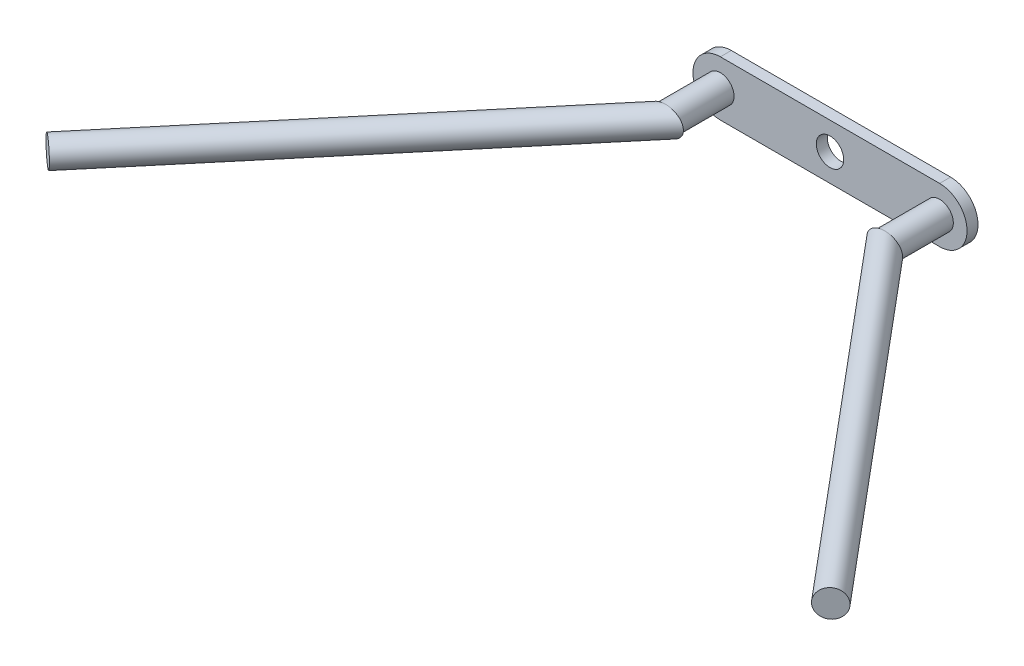
ISO-10303-21;
HEADER;
FILE_DESCRIPTION(('STEP AP214'),'2;1');
FILE_NAME('part.step','',(''),(''),'','','');
FILE_SCHEMA(('AUTOMOTIVE_DESIGN { 1 0 10303 214 1 1 1 1 }'));
ENDSEC;
DATA;
#1=APPLICATION_CONTEXT('core data for automotive mechanical design processes');
#2=APPLICATION_PROTOCOL_DEFINITION('international standard','automotive_design',2000,#1);
#3=PRODUCT_CONTEXT('',#1,'mechanical');
#4=PRODUCT('Part','Part','',(#3));
#5=PRODUCT_RELATED_PRODUCT_CATEGORY('part','',(#4));
#6=PRODUCT_DEFINITION_FORMATION('','',#4);
#7=PRODUCT_DEFINITION_CONTEXT('part definition',#1,'design');
#8=PRODUCT_DEFINITION('design','',#6,#7);
#9=PRODUCT_DEFINITION_SHAPE('','',#8);
#10=(LENGTH_UNIT() NAMED_UNIT(*) SI_UNIT(.MILLI.,.METRE.));
#11=(NAMED_UNIT(*) PLANE_ANGLE_UNIT() SI_UNIT($,.RADIAN.));
#12=(NAMED_UNIT(*) SI_UNIT($,.STERADIAN.) SOLID_ANGLE_UNIT());
#13=UNCERTAINTY_MEASURE_WITH_UNIT(LENGTH_MEASURE(1.E-05),#10,'distance_accuracy_value','');
#14=(GEOMETRIC_REPRESENTATION_CONTEXT(3) GLOBAL_UNCERTAINTY_ASSIGNED_CONTEXT((#13)) GLOBAL_UNIT_ASSIGNED_CONTEXT((#10,
#11,#12)) REPRESENTATION_CONTEXT('',''));
#15=CARTESIAN_POINT('',(0.,0.,0.));
#16=DIRECTION('',(0.,0.,1.));
#17=DIRECTION('',(1.,0.,0.));
#18=AXIS2_PLACEMENT_3D('',#15,#16,#17);
#19=CARTESIAN_POINT('',(0.,0.,2.));
#20=DIRECTION('',(0.,0.,1.));
#21=DIRECTION('',(1.,0.,0.));
#22=AXIS2_PLACEMENT_3D('',#19,#20,#21);
#23=PLANE('',#22);
#24=CARTESIAN_POINT('',(40.,0.,2.));
#25=DIRECTION('',(0.,0.,1.));
#26=DIRECTION('',(1.,0.,0.));
#27=AXIS2_PLACEMENT_3D('',#24,#25,#26);
#28=CIRCLE('',#27,2.5);
#29=CARTESIAN_POINT('',(42.5,0.,2.));
#30=VERTEX_POINT('',#29);
#31=EDGE_CURVE('E95',#30,#30,#28,.T.);
#32=ORIENTED_EDGE('',*,*,#31,.F.);
#33=EDGE_LOOP('',(#32));
#34=FACE_BOUND('',#33,.T.);
#35=CARTESIAN_POINT('',(0.,0.,2.));
#36=DIRECTION('',(0.,0.,1.));
#37=DIRECTION('',(1.,0.,0.));
#38=AXIS2_PLACEMENT_3D('',#35,#36,#37);
#39=CIRCLE('',#38,2.5);
#40=CARTESIAN_POINT('',(2.5,0.,2.));
#41=VERTEX_POINT('',#40);
#42=EDGE_CURVE('E88',#41,#41,#39,.T.);
#43=ORIENTED_EDGE('',*,*,#42,.F.);
#44=EDGE_LOOP('',(#43));
#45=FACE_BOUND('',#44,.T.);
#46=CARTESIAN_POINT('',(0.,0.,2.));
#47=DIRECTION('',(0.,0.,1.));
#48=DIRECTION('',(1.,0.,0.));
#49=AXIS2_PLACEMENT_3D('',#46,#47,#48);
#50=CIRCLE('',#49,5.);
#51=CARTESIAN_POINT('',(0.,5.,2.));
#52=VERTEX_POINT('',#51);
#53=CARTESIAN_POINT('',(0.,-5.,2.));
#54=VERTEX_POINT('',#53);
#55=EDGE_CURVE('E125',#52,#54,#50,.T.);
#56=ORIENTED_EDGE('',*,*,#55,.T.);
#57=DIRECTION('',(1.,0.,0.));
#58=VECTOR('',#57,1.);
#59=CARTESIAN_POINT('',(0.,-5.,2.));
#60=LINE('',#59,#58);
#61=CARTESIAN_POINT('',(40.,-5.,2.));
#62=VERTEX_POINT('',#61);
#63=EDGE_CURVE('E128',#54,#62,#60,.T.);
#64=ORIENTED_EDGE('',*,*,#63,.T.);
#65=CARTESIAN_POINT('',(40.,0.,2.));
#66=DIRECTION('',(0.,0.,1.));
#67=DIRECTION('',(1.,0.,0.));
#68=AXIS2_PLACEMENT_3D('',#65,#66,#67);
#69=CIRCLE('',#68,5.);
#70=CARTESIAN_POINT('',(40.,5.,2.));
#71=VERTEX_POINT('',#70);
#72=EDGE_CURVE('E131',#62,#71,#69,.T.);
#73=ORIENTED_EDGE('',*,*,#72,.T.);
#74=DIRECTION('',(-1.,0.,0.));
#75=VECTOR('',#74,1.);
#76=CARTESIAN_POINT('',(0.,5.,2.));
#77=LINE('',#76,#75);
#78=EDGE_CURVE('E133',#71,#52,#77,.T.);
#79=ORIENTED_EDGE('',*,*,#78,.T.);
#80=EDGE_LOOP('',(#56,#64,#73,#79));
#81=FACE_BOUND('',#80,.T.);
#82=CARTESIAN_POINT('',(20.,0.,2.));
#83=DIRECTION('',(0.,0.,1.));
#84=DIRECTION('',(1.,0.,0.));
#85=AXIS2_PLACEMENT_3D('',#82,#83,#84);
#86=CIRCLE('',#85,2.5);
#87=CARTESIAN_POINT('',(22.5,0.,2.));
#88=VERTEX_POINT('',#87);
#89=EDGE_CURVE('E119',#88,#88,#86,.T.);
#90=ORIENTED_EDGE('',*,*,#89,.F.);
#91=EDGE_LOOP('',(#90));
#92=FACE_BOUND('',#91,.T.);
#93=ADVANCED_FACE('F32',(#34,#45,#81,#92),#23,.T.);
#94=CARTESIAN_POINT('',(0.,0.,0.));
#95=DIRECTION('',(0.,0.,1.));
#96=DIRECTION('',(1.,0.,0.));
#97=AXIS2_PLACEMENT_3D('',#94,#95,#96);
#98=PLANE('',#97);
#99=CARTESIAN_POINT('',(0.,0.,0.));
#100=DIRECTION('',(0.,0.,1.));
#101=DIRECTION('',(1.,0.,0.));
#102=AXIS2_PLACEMENT_3D('',#99,#100,#101);
#103=CIRCLE('',#102,5.);
#104=CARTESIAN_POINT('',(0.,5.,0.));
#105=VERTEX_POINT('',#104);
#106=CARTESIAN_POINT('',(0.,-5.,0.));
#107=VERTEX_POINT('',#106);
#108=EDGE_CURVE('E122',#105,#107,#103,.T.);
#109=ORIENTED_EDGE('',*,*,#108,.F.);
#110=DIRECTION('',(-1.,0.,0.));
#111=VECTOR('',#110,1.);
#112=CARTESIAN_POINT('',(0.,5.,0.));
#113=LINE('',#112,#111);
#114=CARTESIAN_POINT('',(40.,5.,0.));
#115=VERTEX_POINT('',#114);
#116=EDGE_CURVE('E129',#115,#105,#113,.T.);
#117=ORIENTED_EDGE('',*,*,#116,.F.);
#118=CARTESIAN_POINT('',(40.,0.,0.));
#119=DIRECTION('',(0.,0.,1.));
#120=DIRECTION('',(1.,0.,0.));
#121=AXIS2_PLACEMENT_3D('',#118,#119,#120);
#122=CIRCLE('',#121,5.);
#123=CARTESIAN_POINT('',(40.,-5.,0.));
#124=VERTEX_POINT('',#123);
#125=EDGE_CURVE('E140',#124,#115,#122,.T.);
#126=ORIENTED_EDGE('',*,*,#125,.F.);
#127=DIRECTION('',(1.,0.,0.));
#128=VECTOR('',#127,1.);
#129=CARTESIAN_POINT('',(0.,-5.,0.));
#130=LINE('',#129,#128);
#131=EDGE_CURVE('E138',#107,#124,#130,.T.);
#132=ORIENTED_EDGE('',*,*,#131,.F.);
#133=EDGE_LOOP('',(#109,#117,#126,#132));
#134=FACE_BOUND('',#133,.T.);
#135=CARTESIAN_POINT('',(20.,0.,0.));
#136=DIRECTION('',(0.,0.,1.));
#137=DIRECTION('',(1.,0.,0.));
#138=AXIS2_PLACEMENT_3D('',#135,#136,#137);
#139=CIRCLE('',#138,2.5);
#140=CARTESIAN_POINT('',(22.5,0.,0.));
#141=VERTEX_POINT('',#140);
#142=EDGE_CURVE('E116',#141,#141,#139,.T.);
#143=ORIENTED_EDGE('',*,*,#142,.T.);
#144=EDGE_LOOP('',(#143));
#145=FACE_BOUND('',#144,.T.);
#146=ADVANCED_FACE('F158',(#134,#145),#98,.F.);
#147=CARTESIAN_POINT('',(0.,0.,2.));
#148=DIRECTION('',(0.,0.,-1.));
#149=DIRECTION('',(-1.,0.,0.));
#150=AXIS2_PLACEMENT_3D('',#147,#148,#149);
#151=CYLINDRICAL_SURFACE('',#150,5.);
#152=ORIENTED_EDGE('',*,*,#108,.T.);
#153=DIRECTION('',(0.,0.,-1.));
#154=VECTOR('',#153,1.);
#155=CARTESIAN_POINT('',(0.,-5.,2.));
#156=LINE('',#155,#154);
#157=EDGE_CURVE('E11',#54,#107,#156,.T.);
#158=ORIENTED_EDGE('',*,*,#157,.F.);
#159=ORIENTED_EDGE('',*,*,#55,.F.);
#160=DIRECTION('',(0.,0.,-1.));
#161=VECTOR('',#160,1.);
#162=CARTESIAN_POINT('',(0.,5.,2.));
#163=LINE('',#162,#161);
#164=EDGE_CURVE('E135',#52,#105,#163,.T.);
#165=ORIENTED_EDGE('',*,*,#164,.T.);
#166=EDGE_LOOP('',(#152,#158,#159,#165));
#167=FACE_BOUND('',#166,.T.);
#168=ADVANCED_FACE('F34',(#167),#151,.T.);
#169=CARTESIAN_POINT('',(0.,-5.,2.));
#170=DIRECTION('',(0.,1.,0.));
#171=DIRECTION('',(0.,0.,1.));
#172=AXIS2_PLACEMENT_3D('',#169,#170,#171);
#173=PLANE('',#172);
#174=ORIENTED_EDGE('',*,*,#131,.T.);
#175=DIRECTION('',(0.,0.,-1.));
#176=VECTOR('',#175,1.);
#177=CARTESIAN_POINT('',(40.,-5.,2.));
#178=LINE('',#177,#176);
#179=EDGE_CURVE('E40',#62,#124,#178,.T.);
#180=ORIENTED_EDGE('',*,*,#179,.F.);
#181=ORIENTED_EDGE('',*,*,#63,.F.);
#182=ORIENTED_EDGE('',*,*,#157,.T.);
#183=EDGE_LOOP('',(#174,#180,#181,#182));
#184=FACE_BOUND('',#183,.T.);
#185=ADVANCED_FACE('F169',(#184),#173,.F.);
#186=CARTESIAN_POINT('',(40.,0.,2.));
#187=DIRECTION('',(0.,0.,-1.));
#188=DIRECTION('',(-1.,0.,0.));
#189=AXIS2_PLACEMENT_3D('',#186,#187,#188);
#190=CYLINDRICAL_SURFACE('',#189,5.);
#191=ORIENTED_EDGE('',*,*,#125,.T.);
#192=DIRECTION('',(0.,0.,-1.));
#193=VECTOR('',#192,1.);
#194=CARTESIAN_POINT('',(40.,5.,2.));
#195=LINE('',#194,#193);
#196=EDGE_CURVE('E145',#71,#115,#195,.T.);
#197=ORIENTED_EDGE('',*,*,#196,.F.);
#198=ORIENTED_EDGE('',*,*,#72,.F.);
#199=ORIENTED_EDGE('',*,*,#179,.T.);
#200=EDGE_LOOP('',(#191,#197,#198,#199));
#201=FACE_BOUND('',#200,.T.);
#202=ADVANCED_FACE('F152',(#201),#190,.T.);
#203=CARTESIAN_POINT('',(0.,5.,2.));
#204=DIRECTION('',(0.,-1.,0.));
#205=DIRECTION('',(0.,0.,-1.));
#206=AXIS2_PLACEMENT_3D('',#203,#204,#205);
#207=PLANE('',#206);
#208=ORIENTED_EDGE('',*,*,#116,.T.);
#209=ORIENTED_EDGE('',*,*,#164,.F.);
#210=ORIENTED_EDGE('',*,*,#78,.F.);
#211=ORIENTED_EDGE('',*,*,#196,.T.);
#212=EDGE_LOOP('',(#208,#209,#210,#211));
#213=FACE_BOUND('',#212,.T.);
#214=ADVANCED_FACE('F162',(#213),#207,.F.);
#215=CARTESIAN_POINT('',(20.,0.,2.));
#216=DIRECTION('',(0.,0.,-1.));
#217=DIRECTION('',(-1.,0.,0.));
#218=AXIS2_PLACEMENT_3D('',#215,#216,#217);
#219=CYLINDRICAL_SURFACE('',#218,2.5);
#220=ORIENTED_EDGE('',*,*,#89,.T.);
#221=EDGE_LOOP('',(#220));
#222=FACE_BOUND('',#221,.T.);
#223=ORIENTED_EDGE('',*,*,#142,.F.);
#224=EDGE_LOOP('',(#223));
#225=FACE_BOUND('',#224,.T.);
#226=ADVANCED_FACE('F186',(#222,#225),#219,.F.);
#227=CARTESIAN_POINT('',(0.,0.,12.));
#228=DIRECTION('',(0.,0.,-1.));
#229=DIRECTION('',(-1.,0.,0.));
#230=AXIS2_PLACEMENT_3D('',#227,#228,#229);
#231=CYLINDRICAL_SURFACE('',#230,2.5);
#232=CARTESIAN_POINT('',(0.,0.,12.));
#233=DIRECTION('',(0.,0.,1.));
#234=DIRECTION('',(1.,0.,0.));
#235=AXIS2_PLACEMENT_3D('',#232,#233,#234);
#236=CIRCLE('',#235,2.5);
#237=CARTESIAN_POINT('',(0.,2.49999999999999,12.));
#238=VERTEX_POINT('',#237);
#239=CARTESIAN_POINT('',(0.,-2.5,12.));
#240=VERTEX_POINT('',#239);
#241=EDGE_CURVE('E114',#238,#240,#236,.T.);
#242=ORIENTED_EDGE('',*,*,#241,.F.);
#243=EDGE_CURVE('E53',#240,#238,#236,.T.);
#244=ORIENTED_EDGE('',*,*,#243,.F.);
#245=EDGE_LOOP('',(#242,#244));
#246=FACE_BOUND('',#245,.T.);
#247=ORIENTED_EDGE('',*,*,#42,.T.);
#248=EDGE_LOOP('',(#247));
#249=FACE_BOUND('',#248,.T.);
#250=ADVANCED_FACE('F193',(#246,#249),#231,.T.);
#251=CARTESIAN_POINT('',(40.,0.,12.));
#252=DIRECTION('',(0.,0.,-1.));
#253=DIRECTION('',(-1.,0.,0.));
#254=AXIS2_PLACEMENT_3D('',#251,#252,#253);
#255=CYLINDRICAL_SURFACE('',#254,2.5);
#256=CARTESIAN_POINT('',(40.,0.,12.));
#257=DIRECTION('',(0.,0.,1.));
#258=DIRECTION('',(1.,0.,0.));
#259=AXIS2_PLACEMENT_3D('',#256,#257,#258);
#260=CIRCLE('',#259,2.5);
#261=CARTESIAN_POINT('',(40.,2.5,12.));
#262=VERTEX_POINT('',#261);
#263=CARTESIAN_POINT('',(40.,-2.5,12.));
#264=VERTEX_POINT('',#263);
#265=EDGE_CURVE('E82',#262,#264,#260,.T.);
#266=ORIENTED_EDGE('',*,*,#265,.F.);
#267=EDGE_CURVE('E46',#264,#262,#260,.T.);
#268=ORIENTED_EDGE('',*,*,#267,.F.);
#269=EDGE_LOOP('',(#266,#268));
#270=FACE_BOUND('',#269,.T.);
#271=ORIENTED_EDGE('',*,*,#31,.T.);
#272=EDGE_LOOP('',(#271));
#273=FACE_BOUND('',#272,.T.);
#274=ADVANCED_FACE('F83',(#270,#273),#255,.T.);
#275=CARTESIAN_POINT('',(0.,0.,12.));
#276=DIRECTION('',(0.,0.,1.));
#277=DIRECTION('',(1.,0.,0.));
#278=AXIS2_PLACEMENT_3D('',#275,#276,#277);
#279=PLANE('',#278);
#280=CARTESIAN_POINT('',(0.,0.,12.));
#281=DIRECTION('',(0.,0.,1.));
#282=DIRECTION('',(-1.,0.,0.));
#283=AXIS2_PLACEMENT_3D('',#280,#281,#282);
#284=ELLIPSE('',#283,3.26351822333069,2.49999999999999);
#285=EDGE_CURVE('E105',#240,#238,#284,.F.);
#286=ORIENTED_EDGE('',*,*,#285,.T.);
#287=ORIENTED_EDGE('',*,*,#241,.T.);
#288=EDGE_LOOP('',(#286,#287));
#289=FACE_BOUND('',#288,.T.);
#290=ADVANCED_FACE('F204',(#289),#279,.F.);
#291=EDGE_CURVE('E109',#238,#240,#284,.F.);
#292=ORIENTED_EDGE('',*,*,#291,.T.);
#293=ORIENTED_EDGE('',*,*,#243,.T.);
#294=EDGE_LOOP('',(#292,#293));
#295=FACE_BOUND('',#294,.T.);
#296=ADVANCED_FACE('F212',(#295),#279,.F.);
#297=CARTESIAN_POINT('',(5.23926258484315,0.,5.75608999196878));
#298=DIRECTION('',(-0.642787609686541,0.,0.766044443118977));
#299=DIRECTION('',(0.766044443118977,0.,0.642787609686541));
#300=AXIS2_PLACEMENT_3D('',#297,#298,#299);
#301=CYLINDRICAL_SURFACE('',#300,2.49999999999999);
#302=ORIENTED_EDGE('',*,*,#291,.F.);
#303=ORIENTED_EDGE('',*,*,#285,.F.);
#304=EDGE_LOOP('',(#302,#303));
#305=FACE_BOUND('',#304,.T.);
#306=CARTESIAN_POINT('',(-51.4230087749233,0.,73.2835554495182));
#307=DIRECTION('',(-0.642787609686541,0.,0.766044443118977));
#308=DIRECTION('',(0.766044443118977,0.,0.642787609686541));
#309=AXIS2_PLACEMENT_3D('',#306,#307,#308);
#310=CIRCLE('',#309,2.49999999999999);
#311=CARTESIAN_POINT('',(-49.5078976671259,0.,74.8905244737345));
#312=VERTEX_POINT('',#311);
#313=EDGE_CURVE('E103',#312,#312,#310,.T.);
#314=ORIENTED_EDGE('',*,*,#313,.F.);
#315=EDGE_LOOP('',(#314));
#316=FACE_BOUND('',#315,.T.);
#317=ADVANCED_FACE('F208',(#305,#316),#301,.T.);
#318=CARTESIAN_POINT('',(-51.4230087749233,0.,73.2835554495182));
#319=DIRECTION('',(-0.642787609686541,0.,0.766044443118977));
#320=DIRECTION('',(0.766044443118977,0.,0.642787609686541));
#321=AXIS2_PLACEMENT_3D('',#318,#319,#320);
#322=PLANE('',#321);
#323=ORIENTED_EDGE('',*,*,#313,.T.);
#324=EDGE_LOOP('',(#323));
#325=FACE_BOUND('',#324,.T.);
#326=ADVANCED_FACE('F211',(#325),#322,.T.);
#327=CARTESIAN_POINT('',(40.,0.,12.));
#328=DIRECTION('',(0.,0.,1.));
#329=DIRECTION('',(1.,0.,0.));
#330=AXIS2_PLACEMENT_3D('',#327,#328,#329);
#331=PLANE('',#330);
#332=CARTESIAN_POINT('',(40.,0.,12.));
#333=DIRECTION('',(0.,0.,1.));
#334=DIRECTION('',(1.,0.,0.));
#335=AXIS2_PLACEMENT_3D('',#332,#333,#334);
#336=ELLIPSE('',#335,3.2635182233307,2.5);
#337=EDGE_CURVE('E99',#264,#262,#336,.F.);
#338=ORIENTED_EDGE('',*,*,#337,.T.);
#339=ORIENTED_EDGE('',*,*,#265,.T.);
#340=EDGE_LOOP('',(#338,#339));
#341=FACE_BOUND('',#340,.T.);
#342=ADVANCED_FACE('F102',(#341),#331,.F.);
#343=EDGE_CURVE('E93',#262,#264,#336,.F.);
#344=ORIENTED_EDGE('',*,*,#343,.T.);
#345=ORIENTED_EDGE('',*,*,#267,.T.);
#346=EDGE_LOOP('',(#344,#345));
#347=FACE_BOUND('',#346,.T.);
#348=ADVANCED_FACE('F92',(#347),#331,.F.);
#349=CARTESIAN_POINT('',(34.7607374151568,0.,5.75608999196875));
#350=DIRECTION('',(0.64278760968654,0.,0.766044443118977));
#351=DIRECTION('',(0.766044443118977,0.,-0.64278760968654));
#352=AXIS2_PLACEMENT_3D('',#349,#350,#351);
#353=CYLINDRICAL_SURFACE('',#352,2.5);
#354=ORIENTED_EDGE('',*,*,#337,.F.);
#355=ORIENTED_EDGE('',*,*,#343,.F.);
#356=EDGE_LOOP('',(#354,#355));
#357=FACE_BOUND('',#356,.T.);
#358=CARTESIAN_POINT('',(91.4230087749232,0.,73.2835554495182));
#359=DIRECTION('',(0.64278760968654,0.,0.766044443118977));
#360=DIRECTION('',(0.766044443118977,0.,-0.64278760968654));
#361=AXIS2_PLACEMENT_3D('',#358,#359,#360);
#362=CIRCLE('',#361,2.5);
#363=CARTESIAN_POINT('',(93.3381198827207,0.,71.6765864253019));
#364=VERTEX_POINT('',#363);
#365=EDGE_CURVE('E100',#364,#364,#362,.T.);
#366=ORIENTED_EDGE('',*,*,#365,.F.);
#367=EDGE_LOOP('',(#366));
#368=FACE_BOUND('',#367,.T.);
#369=ADVANCED_FACE('F97',(#357,#368),#353,.T.);
#370=CARTESIAN_POINT('',(91.4230087749232,0.,73.2835554495182));
#371=DIRECTION('',(0.64278760968654,0.,0.766044443118977));
#372=DIRECTION('',(0.766044443118977,0.,-0.64278760968654));
#373=AXIS2_PLACEMENT_3D('',#370,#371,#372);
#374=PLANE('',#373);
#375=ORIENTED_EDGE('',*,*,#365,.T.);
#376=EDGE_LOOP('',(#375));
#377=FACE_BOUND('',#376,.T.);
#378=ADVANCED_FACE('F222',(#377),#374,.T.);
#379=CLOSED_SHELL('',(#93,#146,#168,#185,#202,#214,#226,#250,#274,#290,#296,#317,#326,#342,#348,
#369,#378));
#380=MANIFOLD_SOLID_BREP('B2',#379);
#381=ADVANCED_BREP_SHAPE_REPRESENTATION('',(#18,#380),#14);
#382=SHAPE_DEFINITION_REPRESENTATION(#9,#381);
ENDSEC;
END-ISO-10303-21;
